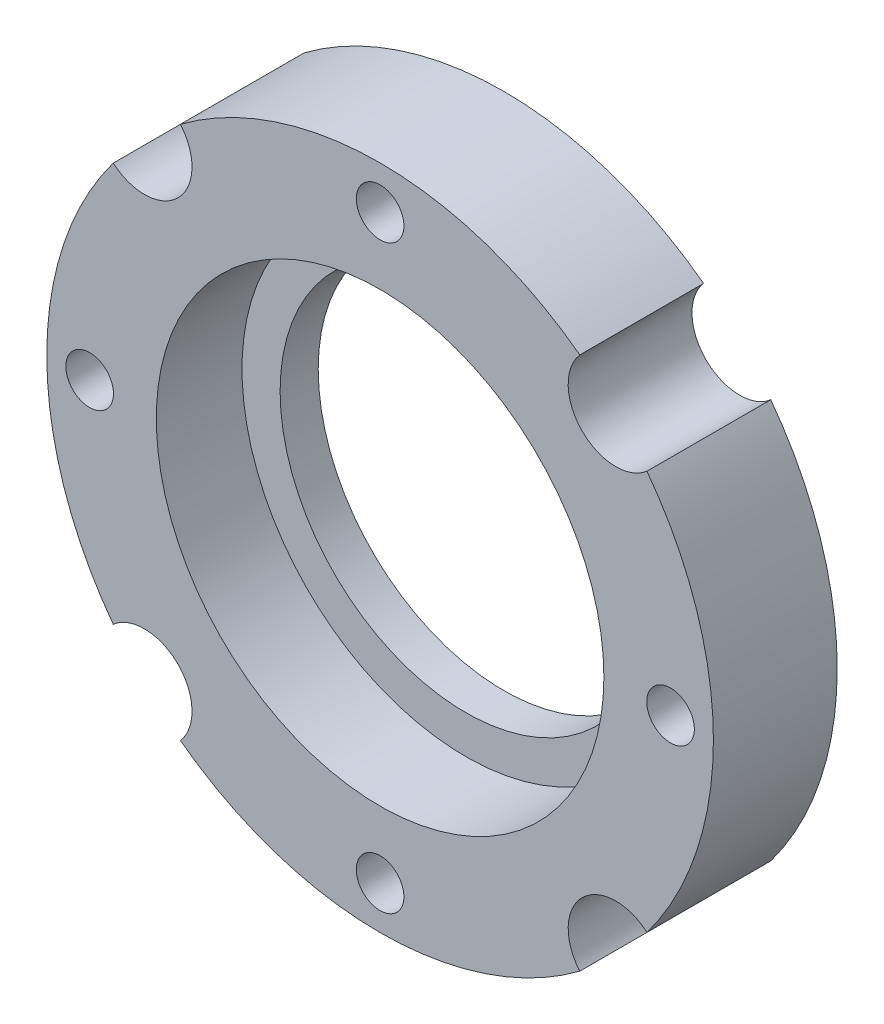
ISO-10303-21;
HEADER;
FILE_DESCRIPTION(('STEP AP214'),'2;1');
FILE_NAME('part.step','',(''),(''),'','','');
FILE_SCHEMA(('AUTOMOTIVE_DESIGN { 1 0 10303 214 1 1 1 1 }'));
ENDSEC;
DATA;
#1=APPLICATION_CONTEXT('core data for automotive mechanical design processes');
#2=APPLICATION_PROTOCOL_DEFINITION('international standard','automotive_design',2000,#1);
#3=PRODUCT_CONTEXT('',#1,'mechanical');
#4=PRODUCT('Part','Part','',(#3));
#5=PRODUCT_RELATED_PRODUCT_CATEGORY('part','',(#4));
#6=PRODUCT_DEFINITION_FORMATION('','',#4);
#7=PRODUCT_DEFINITION_CONTEXT('part definition',#1,'design');
#8=PRODUCT_DEFINITION('design','',#6,#7);
#9=PRODUCT_DEFINITION_SHAPE('','',#8);
#10=(LENGTH_UNIT() NAMED_UNIT(*) SI_UNIT(.MILLI.,.METRE.));
#11=(NAMED_UNIT(*) PLANE_ANGLE_UNIT() SI_UNIT($,.RADIAN.));
#12=(NAMED_UNIT(*) SI_UNIT($,.STERADIAN.) SOLID_ANGLE_UNIT());
#13=UNCERTAINTY_MEASURE_WITH_UNIT(LENGTH_MEASURE(1.E-05),#10,'distance_accuracy_value','');
#14=(GEOMETRIC_REPRESENTATION_CONTEXT(3) GLOBAL_UNCERTAINTY_ASSIGNED_CONTEXT((#13)) GLOBAL_UNIT_ASSIGNED_CONTEXT((#10,
#11,#12)) REPRESENTATION_CONTEXT('',''));
#15=CARTESIAN_POINT('',(0.,0.,0.));
#16=DIRECTION('',(0.,0.,1.));
#17=DIRECTION('',(1.,0.,0.));
#18=AXIS2_PLACEMENT_3D('',#15,#16,#17);
#19=CARTESIAN_POINT('',(0.,0.,13.));
#20=DIRECTION('',(0.,0.,-1.));
#21=DIRECTION('',(-1.,0.,0.));
#22=AXIS2_PLACEMENT_3D('',#19,#20,#21);
#23=CYLINDRICAL_SURFACE('',#22,35.);
#24=CARTESIAN_POINT('',(0.,0.,0.));
#25=DIRECTION('',(0.,0.,1.));
#26=DIRECTION('',(1.,0.,0.));
#27=AXIS2_PLACEMENT_3D('',#24,#25,#26);
#28=CIRCLE('',#27,35.);
#29=CARTESIAN_POINT('',(-20.9696960521531,-28.022702358629,0.));
#30=VERTEX_POINT('',#29);
#31=CARTESIAN_POINT('',(20.9696960521534,-28.0227023586288,0.));
#32=VERTEX_POINT('',#31);
#33=EDGE_CURVE('E141',#30,#32,#28,.T.);
#34=ORIENTED_EDGE('',*,*,#33,.T.);
#35=DIRECTION('',(0.,0.,1.));
#36=VECTOR('',#35,1.);
#37=CARTESIAN_POINT('',(20.9696960521534,-28.0227023586288,6.));
#38=LINE('',#37,#36);
#39=CARTESIAN_POINT('',(20.9696960521534,-28.0227023586288,13.));
#40=VERTEX_POINT('',#39);
#41=EDGE_CURVE('E56',#32,#40,#38,.T.);
#42=ORIENTED_EDGE('',*,*,#41,.T.);
#43=CARTESIAN_POINT('',(0.,0.,13.));
#44=DIRECTION('',(0.,0.,1.));
#45=DIRECTION('',(1.,0.,0.));
#46=AXIS2_PLACEMENT_3D('',#43,#44,#45);
#47=CIRCLE('',#46,35.);
#48=CARTESIAN_POINT('',(-20.9696960521531,-28.0227023586291,13.));
#49=VERTEX_POINT('',#48);
#50=EDGE_CURVE('E128',#49,#40,#47,.T.);
#51=ORIENTED_EDGE('',*,*,#50,.F.);
#52=DIRECTION('',(0.,0.,1.));
#53=VECTOR('',#52,1.);
#54=CARTESIAN_POINT('',(-20.9696960521531,-28.0227023586291,6.));
#55=LINE('',#54,#53);
#56=EDGE_CURVE('E106',#49,#30,#55,.F.);
#57=ORIENTED_EDGE('',*,*,#56,.T.);
#58=EDGE_LOOP('',(#34,#42,#51,#57));
#59=FACE_BOUND('',#58,.T.);
#60=ADVANCED_FACE('F41',(#59),#23,.T.);
#61=CARTESIAN_POINT('',(28.0227023586289,-20.9696960521533,13.));
#62=VERTEX_POINT('',#61);
#63=CARTESIAN_POINT('',(28.0227023586288,20.9696960521534,13.));
#64=VERTEX_POINT('',#63);
#65=EDGE_CURVE('E131',#62,#64,#47,.T.);
#66=ORIENTED_EDGE('',*,*,#65,.F.);
#67=DIRECTION('',(0.,0.,1.));
#68=VECTOR('',#67,1.);
#69=CARTESIAN_POINT('',(28.0227023586289,-20.9696960521533,6.));
#70=LINE('',#69,#68);
#71=CARTESIAN_POINT('',(28.0227023586289,-20.9696960521533,0.));
#72=VERTEX_POINT('',#71);
#73=EDGE_CURVE('E163',#62,#72,#70,.F.);
#74=ORIENTED_EDGE('',*,*,#73,.T.);
#75=CARTESIAN_POINT('',(28.0227023586288,20.9696960521534,0.));
#76=VERTEX_POINT('',#75);
#77=EDGE_CURVE('E138',#72,#76,#28,.T.);
#78=ORIENTED_EDGE('',*,*,#77,.T.);
#79=DIRECTION('',(0.,0.,1.));
#80=VECTOR('',#79,1.);
#81=CARTESIAN_POINT('',(28.0227023586288,20.9696960521534,6.));
#82=LINE('',#81,#80);
#83=EDGE_CURVE('E162',#76,#64,#82,.T.);
#84=ORIENTED_EDGE('',*,*,#83,.T.);
#85=EDGE_LOOP('',(#66,#74,#78,#84));
#86=FACE_BOUND('',#85,.T.);
#87=ADVANCED_FACE('F161',(#86),#23,.T.);
#88=CARTESIAN_POINT('',(20.9696960521533,28.0227023586289,13.));
#89=VERTEX_POINT('',#88);
#90=CARTESIAN_POINT('',(-20.9696960521531,28.0227023586291,13.));
#91=VERTEX_POINT('',#90);
#92=EDGE_CURVE('E127',#89,#91,#47,.T.);
#93=ORIENTED_EDGE('',*,*,#92,.F.);
#94=DIRECTION('',(0.,0.,1.));
#95=VECTOR('',#94,1.);
#96=CARTESIAN_POINT('',(20.9696960521533,28.0227023586289,6.));
#97=LINE('',#96,#95);
#98=CARTESIAN_POINT('',(20.9696960521533,28.0227023586289,0.));
#99=VERTEX_POINT('',#98);
#100=EDGE_CURVE('E167',#89,#99,#97,.F.);
#101=ORIENTED_EDGE('',*,*,#100,.T.);
#102=CARTESIAN_POINT('',(-20.9696960521531,28.022702358629,0.));
#103=VERTEX_POINT('',#102);
#104=EDGE_CURVE('E142',#99,#103,#28,.T.);
#105=ORIENTED_EDGE('',*,*,#104,.T.);
#106=DIRECTION('',(0.,0.,1.));
#107=VECTOR('',#106,1.);
#108=CARTESIAN_POINT('',(-20.9696960521531,28.0227023586291,6.));
#109=LINE('',#108,#107);
#110=EDGE_CURVE('E238',#103,#91,#109,.T.);
#111=ORIENTED_EDGE('',*,*,#110,.T.);
#112=EDGE_LOOP('',(#93,#101,#105,#111));
#113=FACE_BOUND('',#112,.T.);
#114=ADVANCED_FACE('F223',(#113),#23,.T.);
#115=CARTESIAN_POINT('',(0.,0.,13.));
#116=DIRECTION('',(0.,0.,-1.));
#117=DIRECTION('',(-1.,0.,0.));
#118=AXIS2_PLACEMENT_3D('',#115,#116,#117);
#119=CYLINDRICAL_SURFACE('',#118,19.5);
#120=CARTESIAN_POINT('',(0.,0.,0.));
#121=DIRECTION('',(0.,0.,1.));
#122=DIRECTION('',(1.,0.,0.));
#123=AXIS2_PLACEMENT_3D('',#120,#121,#122);
#124=CIRCLE('',#123,19.5);
#125=CARTESIAN_POINT('',(-19.5,0.,0.));
#126=VERTEX_POINT('',#125);
#127=EDGE_CURVE('E135',#126,#126,#124,.T.);
#128=CARTESIAN_POINT('',(0.,0.,4.));
#129=DIRECTION('',(0.,0.,1.));
#130=DIRECTION('',(1.,0.,0.));
#131=AXIS2_PLACEMENT_3D('',#128,#129,#130);
#132=CIRCLE('',#131,19.5);
#133=CARTESIAN_POINT('',(-19.5,0.,4.));
#134=VERTEX_POINT('',#133);
#135=EDGE_CURVE('E165',#134,#134,#132,.T.);
#136=CARTESIAN_POINT('',(-19.5,0.,0.));
#137=CARTESIAN_POINT('',(-19.5,0.,0.0416666666666667));
#138=CARTESIAN_POINT('',(-19.5,0.,0.0833333333333334));
#139=CARTESIAN_POINT('',(-19.5,0.,0.166666666666667));
#140=CARTESIAN_POINT('',(-19.5,0.,0.208333333333334));
#141=CARTESIAN_POINT('',(-19.5,0.,0.291666666666667));
#142=CARTESIAN_POINT('',(-19.5,0.,0.333333333333334));
#143=CARTESIAN_POINT('',(-19.5,0.,0.416666666666667));
#144=CARTESIAN_POINT('',(-19.5,0.,0.458333333333334));
#145=CARTESIAN_POINT('',(-19.5,0.,0.541666666666667));
#146=CARTESIAN_POINT('',(-19.5,0.,0.583333333333334));
#147=CARTESIAN_POINT('',(-19.5,0.,0.666666666666667));
#148=CARTESIAN_POINT('',(-19.5,0.,0.708333333333334));
#149=CARTESIAN_POINT('',(-19.5,0.,0.791666666666667));
#150=CARTESIAN_POINT('',(-19.5,0.,0.833333333333334));
#151=CARTESIAN_POINT('',(-19.5,0.,0.916666666666668));
#152=CARTESIAN_POINT('',(-19.5,0.,0.958333333333334));
#153=CARTESIAN_POINT('',(-19.5,0.,1.04166666666667));
#154=CARTESIAN_POINT('',(-19.5,0.,1.08333333333333));
#155=CARTESIAN_POINT('',(-19.5,0.,1.16666666666667));
#156=CARTESIAN_POINT('',(-19.5,0.,1.20833333333333));
#157=CARTESIAN_POINT('',(-19.5,0.,1.29166666666667));
#158=CARTESIAN_POINT('',(-19.5,0.,1.33333333333333));
#159=CARTESIAN_POINT('',(-19.5,0.,1.41666666666667));
#160=CARTESIAN_POINT('',(-19.5,0.,1.45833333333333));
#161=CARTESIAN_POINT('',(-19.5,0.,1.54166666666667));
#162=CARTESIAN_POINT('',(-19.5,0.,1.58333333333333));
#163=CARTESIAN_POINT('',(-19.5,0.,1.66666666666667));
#164=CARTESIAN_POINT('',(-19.5,0.,1.70833333333333));
#165=CARTESIAN_POINT('',(-19.5,0.,1.79166666666667));
#166=CARTESIAN_POINT('',(-19.5,0.,1.83333333333333));
#167=CARTESIAN_POINT('',(-19.5,0.,1.91666666666667));
#168=CARTESIAN_POINT('',(-19.5,0.,1.95833333333333));
#169=CARTESIAN_POINT('',(-19.5,0.,2.04166666666667));
#170=CARTESIAN_POINT('',(-19.5,0.,2.08333333333333));
#171=CARTESIAN_POINT('',(-19.5,0.,2.16666666666667));
#172=CARTESIAN_POINT('',(-19.5,0.,2.20833333333333));
#173=CARTESIAN_POINT('',(-19.5,0.,2.29166666666667));
#174=CARTESIAN_POINT('',(-19.5,0.,2.33333333333333));
#175=CARTESIAN_POINT('',(-19.5,0.,2.41666666666667));
#176=CARTESIAN_POINT('',(-19.5,0.,2.45833333333333));
#177=CARTESIAN_POINT('',(-19.5,0.,2.54166666666667));
#178=CARTESIAN_POINT('',(-19.5,0.,2.58333333333333));
#179=CARTESIAN_POINT('',(-19.5,0.,2.66666666666667));
#180=CARTESIAN_POINT('',(-19.5,0.,2.70833333333333));
#181=CARTESIAN_POINT('',(-19.5,0.,2.79166666666667));
#182=CARTESIAN_POINT('',(-19.5,0.,2.83333333333333));
#183=CARTESIAN_POINT('',(-19.5,0.,2.91666666666667));
#184=CARTESIAN_POINT('',(-19.5,0.,2.95833333333333));
#185=CARTESIAN_POINT('',(-19.5,0.,3.04166666666667));
#186=CARTESIAN_POINT('',(-19.5,0.,3.08333333333333));
#187=CARTESIAN_POINT('',(-19.5,0.,3.16666666666667));
#188=CARTESIAN_POINT('',(-19.5,0.,3.20833333333333));
#189=CARTESIAN_POINT('',(-19.5,0.,3.29166666666667));
#190=CARTESIAN_POINT('',(-19.5,0.,3.33333333333333));
#191=CARTESIAN_POINT('',(-19.5,0.,3.41666666666667));
#192=CARTESIAN_POINT('',(-19.5,0.,3.45833333333333));
#193=CARTESIAN_POINT('',(-19.5,0.,3.54166666666667));
#194=CARTESIAN_POINT('',(-19.5,0.,3.58333333333333));
#195=CARTESIAN_POINT('',(-19.5,0.,3.66666666666667));
#196=CARTESIAN_POINT('',(-19.5,0.,3.70833333333333));
#197=CARTESIAN_POINT('',(-19.5,0.,3.79166666666667));
#198=CARTESIAN_POINT('',(-19.5,0.,3.83333333333333));
#199=CARTESIAN_POINT('',(-19.5,0.,3.91666666666667));
#200=CARTESIAN_POINT('',(-19.5,0.,3.95833333333333));
#201=CARTESIAN_POINT('',(-19.5,0.,4.));
#202=B_SPLINE_CURVE_WITH_KNOTS('',3,(#136,#137,#138,#139,#140,#141,#142,#143,#144,#145,#146,
#147,#148,#149,#150,#151,#152,#153,#154,#155,#156,#157,#158,#159,#160,#161,#162,#163,#164,#165,
#166,#167,#168,#169,#170,#171,#172,#173,#174,#175,#176,#177,#178,#179,#180,#181,#182,#183,#184,
#185,#186,#187,#188,#189,#190,#191,#192,#193,#194,#195,#196,#197,#198,#199,#200,#201),
.UNSPECIFIED.,.F.,.F.,(4,2,2,2,2,2,2,2,2,2,2,2,2,2,2,2,2,2,2,2,2,2,2,2,2,2,2,2,2,2,2,2,4),(0.,
0.125,0.25,0.375,0.5,0.625000000000001,0.750000000000001,0.875000000000001,1.,1.125,1.25,1.375,
1.5,1.625,1.75,1.875,2.,2.125,2.25,2.375,2.5,2.625,2.75,2.875,3.,3.125,3.25,3.375,3.5,3.625,
3.75,3.875,4.),.UNSPECIFIED.);
#203=EDGE_CURVE('BSEAM226',#126,#134,#202,.T.);
#204=ORIENTED_EDGE('',*,*,#127,.F.);
#205=ORIENTED_EDGE('',*,*,#135,.T.);
#206=ORIENTED_EDGE('',*,*,#203,.T.);
#207=ORIENTED_EDGE('',*,*,#203,.F.);
#208=EDGE_LOOP('',(#204,#206,#205,#207));
#209=FACE_BOUND('',#208,.T.);
#210=ADVANCED_FACE('F226',(#209),#119,.F.);
#211=CARTESIAN_POINT('',(-28.0227023586287,20.9696960521536,13.));
#212=VERTEX_POINT('',#211);
#213=CARTESIAN_POINT('',(-28.0227023586287,-20.9696960521536,13.));
#214=VERTEX_POINT('',#213);
#215=EDGE_CURVE('E117',#212,#214,#47,.T.);
#216=ORIENTED_EDGE('',*,*,#215,.F.);
#217=DIRECTION('',(0.,0.,1.));
#218=VECTOR('',#217,1.);
#219=CARTESIAN_POINT('',(-28.0227023586287,20.9696960521536,6.));
#220=LINE('',#219,#218);
#221=CARTESIAN_POINT('',(-28.0227023586287,20.9696960521536,0.));
#222=VERTEX_POINT('',#221);
#223=EDGE_CURVE('E120',#212,#222,#220,.F.);
#224=ORIENTED_EDGE('',*,*,#223,.T.);
#225=CARTESIAN_POINT('',(-28.0227023586287,-20.9696960521536,0.));
#226=VERTEX_POINT('',#225);
#227=EDGE_CURVE('E119',#222,#226,#28,.T.);
#228=ORIENTED_EDGE('',*,*,#227,.T.);
#229=DIRECTION('',(0.,0.,1.));
#230=VECTOR('',#229,1.);
#231=CARTESIAN_POINT('',(-28.0227023586287,-20.9696960521536,6.));
#232=LINE('',#231,#230);
#233=EDGE_CURVE('E63',#226,#214,#232,.T.);
#234=ORIENTED_EDGE('',*,*,#233,.T.);
#235=EDGE_LOOP('',(#216,#224,#228,#234));
#236=FACE_BOUND('',#235,.T.);
#237=ADVANCED_FACE('F43',(#236),#23,.T.);
#238=CARTESIAN_POINT('',(0.,0.,13.));
#239=DIRECTION('',(0.,0.,1.));
#240=DIRECTION('',(1.,0.,0.));
#241=AXIS2_PLACEMENT_3D('',#238,#239,#240);
#242=PLANE('',#241);
#243=CARTESIAN_POINT('',(24.7487373415292,-24.7487373415291,13.));
#244=DIRECTION('',(0.,0.,1.));
#245=DIRECTION('',(1.,0.,0.));
#246=AXIS2_PLACEMENT_3D('',#243,#244,#245);
#247=CIRCLE('',#246,5.);
#248=EDGE_CURVE('E241',#62,#40,#247,.T.);
#249=ORIENTED_EDGE('',*,*,#248,.F.);
#250=ORIENTED_EDGE('',*,*,#65,.T.);
#251=CARTESIAN_POINT('',(24.7487373415291,24.7487373415292,13.));
#252=DIRECTION('',(0.,0.,1.));
#253=DIRECTION('',(1.,0.,0.));
#254=AXIS2_PLACEMENT_3D('',#251,#252,#253);
#255=CIRCLE('',#254,5.);
#256=EDGE_CURVE('E240',#89,#64,#255,.T.);
#257=ORIENTED_EDGE('',*,*,#256,.F.);
#258=ORIENTED_EDGE('',*,*,#92,.T.);
#259=CARTESIAN_POINT('',(-24.748737341529,24.7487373415294,13.));
#260=DIRECTION('',(0.,0.,1.));
#261=DIRECTION('',(1.,0.,0.));
#262=AXIS2_PLACEMENT_3D('',#259,#260,#261);
#263=CIRCLE('',#262,5.);
#264=EDGE_CURVE('E111',#212,#91,#263,.T.);
#265=ORIENTED_EDGE('',*,*,#264,.F.);
#266=ORIENTED_EDGE('',*,*,#215,.T.);
#267=CARTESIAN_POINT('',(-24.748737341529,-24.7487373415294,13.));
#268=DIRECTION('',(0.,0.,1.));
#269=DIRECTION('',(1.,0.,0.));
#270=AXIS2_PLACEMENT_3D('',#267,#268,#269);
#271=CIRCLE('',#270,5.);
#272=EDGE_CURVE('E103',#49,#214,#271,.T.);
#273=ORIENTED_EDGE('',*,*,#272,.F.);
#274=ORIENTED_EDGE('',*,*,#50,.T.);
#275=EDGE_LOOP('',(#249,#250,#257,#258,#265,#266,#273,#274));
#276=FACE_BOUND('',#275,.T.);
#277=CARTESIAN_POINT('',(0.,0.,13.));
#278=DIRECTION('',(0.,0.,1.));
#279=DIRECTION('',(1.,0.,0.));
#280=AXIS2_PLACEMENT_3D('',#277,#278,#279);
#281=CIRCLE('',#280,23.5);
#282=CARTESIAN_POINT('',(23.5,0.,13.));
#283=VERTEX_POINT('',#282);
#284=EDGE_CURVE('E173',#283,#283,#281,.T.);
#285=ORIENTED_EDGE('',*,*,#284,.F.);
#286=EDGE_LOOP('',(#285));
#287=FACE_BOUND('',#286,.T.);
#288=CARTESIAN_POINT('',(0.,30.5,13.));
#289=DIRECTION('',(0.,0.,1.));
#290=DIRECTION('',(1.,0.,0.));
#291=AXIS2_PLACEMENT_3D('',#288,#289,#290);
#292=CIRCLE('',#291,2.49999999999999);
#293=CARTESIAN_POINT('',(2.49999999999999,30.5,13.));
#294=VERTEX_POINT('',#293);
#295=EDGE_CURVE('E177',#294,#294,#292,.T.);
#296=ORIENTED_EDGE('',*,*,#295,.F.);
#297=EDGE_LOOP('',(#296));
#298=FACE_BOUND('',#297,.T.);
#299=CARTESIAN_POINT('',(0.,-30.5,13.));
#300=DIRECTION('',(0.,0.,1.));
#301=DIRECTION('',(1.,0.,0.));
#302=AXIS2_PLACEMENT_3D('',#299,#300,#301);
#303=CIRCLE('',#302,2.49999999999999);
#304=CARTESIAN_POINT('',(2.49999999999999,-30.5,13.));
#305=VERTEX_POINT('',#304);
#306=EDGE_CURVE('E185',#305,#305,#303,.T.);
#307=ORIENTED_EDGE('',*,*,#306,.F.);
#308=EDGE_LOOP('',(#307));
#309=FACE_BOUND('',#308,.T.);
#310=CARTESIAN_POINT('',(-30.5,0.,13.));
#311=DIRECTION('',(0.,0.,1.));
#312=DIRECTION('',(1.,0.,0.));
#313=AXIS2_PLACEMENT_3D('',#310,#311,#312);
#314=CIRCLE('',#313,2.49999999999999);
#315=CARTESIAN_POINT('',(-28.,0.,13.));
#316=VERTEX_POINT('',#315);
#317=EDGE_CURVE('E191',#316,#316,#314,.T.);
#318=ORIENTED_EDGE('',*,*,#317,.F.);
#319=EDGE_LOOP('',(#318));
#320=FACE_BOUND('',#319,.T.);
#321=CARTESIAN_POINT('',(30.5,0.,13.));
#322=DIRECTION('',(0.,0.,1.));
#323=DIRECTION('',(1.,0.,0.));
#324=AXIS2_PLACEMENT_3D('',#321,#322,#323);
#325=CIRCLE('',#324,2.49999999999999);
#326=CARTESIAN_POINT('',(33.,0.,13.));
#327=VERTEX_POINT('',#326);
#328=EDGE_CURVE('E196',#327,#327,#325,.T.);
#329=ORIENTED_EDGE('',*,*,#328,.F.);
#330=EDGE_LOOP('',(#329));
#331=FACE_BOUND('',#330,.T.);
#332=ADVANCED_FACE('F124',(#276,#287,#298,#309,#320,#331),#242,.T.);
#333=CARTESIAN_POINT('',(0.,0.,0.));
#334=DIRECTION('',(0.,0.,1.));
#335=DIRECTION('',(1.,0.,0.));
#336=AXIS2_PLACEMENT_3D('',#333,#334,#335);
#337=PLANE('',#336);
#338=CARTESIAN_POINT('',(0.,30.5,0.));
#339=DIRECTION('',(0.,0.,1.));
#340=DIRECTION('',(1.,0.,0.));
#341=AXIS2_PLACEMENT_3D('',#338,#339,#340);
#342=CIRCLE('',#341,2.5);
#343=CARTESIAN_POINT('',(2.5,30.5,0.));
#344=VERTEX_POINT('',#343);
#345=EDGE_CURVE('E182',#344,#344,#342,.T.);
#346=ORIENTED_EDGE('',*,*,#345,.T.);
#347=EDGE_LOOP('',(#346));
#348=FACE_BOUND('',#347,.T.);
#349=CARTESIAN_POINT('',(0.,-30.5,0.));
#350=DIRECTION('',(0.,0.,1.));
#351=DIRECTION('',(1.,0.,0.));
#352=AXIS2_PLACEMENT_3D('',#349,#350,#351);
#353=CIRCLE('',#352,2.5);
#354=CARTESIAN_POINT('',(2.5,-30.5,0.));
#355=VERTEX_POINT('',#354);
#356=EDGE_CURVE('E188',#355,#355,#353,.T.);
#357=ORIENTED_EDGE('',*,*,#356,.T.);
#358=EDGE_LOOP('',(#357));
#359=FACE_BOUND('',#358,.T.);
#360=CARTESIAN_POINT('',(-30.5,0.,0.));
#361=DIRECTION('',(0.,0.,1.));
#362=DIRECTION('',(1.,0.,0.));
#363=AXIS2_PLACEMENT_3D('',#360,#361,#362);
#364=CIRCLE('',#363,2.5);
#365=CARTESIAN_POINT('',(-28.,0.,0.));
#366=VERTEX_POINT('',#365);
#367=EDGE_CURVE('E194',#366,#366,#364,.T.);
#368=ORIENTED_EDGE('',*,*,#367,.T.);
#369=EDGE_LOOP('',(#368));
#370=FACE_BOUND('',#369,.T.);
#371=CARTESIAN_POINT('',(30.5,0.,0.));
#372=DIRECTION('',(0.,0.,1.));
#373=DIRECTION('',(1.,0.,0.));
#374=AXIS2_PLACEMENT_3D('',#371,#372,#373);
#375=CIRCLE('',#374,2.5);
#376=CARTESIAN_POINT('',(33.,0.,0.));
#377=VERTEX_POINT('',#376);
#378=EDGE_CURVE('E136',#377,#377,#375,.T.);
#379=ORIENTED_EDGE('',*,*,#378,.T.);
#380=EDGE_LOOP('',(#379));
#381=FACE_BOUND('',#380,.T.);
#382=ORIENTED_EDGE('',*,*,#77,.F.);
#383=CARTESIAN_POINT('',(24.7487373415292,-24.7487373415291,0.));
#384=DIRECTION('',(0.,0.,1.));
#385=DIRECTION('',(1.,0.,0.));
#386=AXIS2_PLACEMENT_3D('',#383,#384,#385);
#387=CIRCLE('',#386,5.);
#388=EDGE_CURVE('E11',#72,#32,#387,.T.);
#389=ORIENTED_EDGE('',*,*,#388,.T.);
#390=ORIENTED_EDGE('',*,*,#33,.F.);
#391=CARTESIAN_POINT('',(-24.748737341529,-24.7487373415294,0.));
#392=DIRECTION('',(0.,0.,1.));
#393=DIRECTION('',(1.,0.,0.));
#394=AXIS2_PLACEMENT_3D('',#391,#392,#393);
#395=CIRCLE('',#394,5.);
#396=EDGE_CURVE('E130',#30,#226,#395,.T.);
#397=ORIENTED_EDGE('',*,*,#396,.T.);
#398=ORIENTED_EDGE('',*,*,#227,.F.);
#399=CARTESIAN_POINT('',(-24.748737341529,24.7487373415294,0.));
#400=DIRECTION('',(0.,0.,1.));
#401=DIRECTION('',(1.,0.,0.));
#402=AXIS2_PLACEMENT_3D('',#399,#400,#401);
#403=CIRCLE('',#402,5.);
#404=EDGE_CURVE('E146',#222,#103,#403,.T.);
#405=ORIENTED_EDGE('',*,*,#404,.T.);
#406=ORIENTED_EDGE('',*,*,#104,.F.);
#407=CARTESIAN_POINT('',(24.7487373415291,24.7487373415292,0.));
#408=DIRECTION('',(0.,0.,1.));
#409=DIRECTION('',(1.,0.,0.));
#410=AXIS2_PLACEMENT_3D('',#407,#408,#409);
#411=CIRCLE('',#410,5.);
#412=EDGE_CURVE('E49',#99,#76,#411,.T.);
#413=ORIENTED_EDGE('',*,*,#412,.T.);
#414=EDGE_LOOP('',(#382,#389,#390,#397,#398,#405,#406,#413));
#415=FACE_BOUND('',#414,.T.);
#416=ORIENTED_EDGE('',*,*,#127,.T.);
#417=EDGE_LOOP('',(#416));
#418=FACE_BOUND('',#417,.T.);
#419=ADVANCED_FACE('F152',(#348,#359,#370,#381,#415,#418),#337,.F.);
#420=CARTESIAN_POINT('',(30.5,0.,13.));
#421=DIRECTION('',(0.,0.,1.));
#422=DIRECTION('',(1.,0.,0.));
#423=AXIS2_PLACEMENT_3D('',#420,#421,#422);
#424=CYLINDRICAL_SURFACE('',#423,2.49999999999999);
#425=ORIENTED_EDGE('',*,*,#378,.F.);
#426=EDGE_LOOP('',(#425));
#427=FACE_BOUND('',#426,.T.);
#428=ORIENTED_EDGE('',*,*,#328,.T.);
#429=EDGE_LOOP('',(#428));
#430=FACE_BOUND('',#429,.T.);
#431=ADVANCED_FACE('F204',(#427,#430),#424,.F.);
#432=CARTESIAN_POINT('',(-30.5,0.,13.));
#433=DIRECTION('',(0.,0.,1.));
#434=DIRECTION('',(1.,0.,0.));
#435=AXIS2_PLACEMENT_3D('',#432,#433,#434);
#436=CYLINDRICAL_SURFACE('',#435,2.49999999999999);
#437=ORIENTED_EDGE('',*,*,#367,.F.);
#438=EDGE_LOOP('',(#437));
#439=FACE_BOUND('',#438,.T.);
#440=ORIENTED_EDGE('',*,*,#317,.T.);
#441=EDGE_LOOP('',(#440));
#442=FACE_BOUND('',#441,.T.);
#443=ADVANCED_FACE('F206',(#439,#442),#436,.F.);
#444=CARTESIAN_POINT('',(0.,-30.5,13.));
#445=DIRECTION('',(0.,0.,1.));
#446=DIRECTION('',(1.,0.,0.));
#447=AXIS2_PLACEMENT_3D('',#444,#445,#446);
#448=CYLINDRICAL_SURFACE('',#447,2.49999999999999);
#449=ORIENTED_EDGE('',*,*,#356,.F.);
#450=EDGE_LOOP('',(#449));
#451=FACE_BOUND('',#450,.T.);
#452=ORIENTED_EDGE('',*,*,#306,.T.);
#453=EDGE_LOOP('',(#452));
#454=FACE_BOUND('',#453,.T.);
#455=ADVANCED_FACE('F212',(#451,#454),#448,.F.);
#456=CARTESIAN_POINT('',(0.,30.5,13.));
#457=DIRECTION('',(0.,0.,1.));
#458=DIRECTION('',(1.,0.,0.));
#459=AXIS2_PLACEMENT_3D('',#456,#457,#458);
#460=CYLINDRICAL_SURFACE('',#459,2.49999999999999);
#461=ORIENTED_EDGE('',*,*,#345,.F.);
#462=EDGE_LOOP('',(#461));
#463=FACE_BOUND('',#462,.T.);
#464=ORIENTED_EDGE('',*,*,#295,.T.);
#465=EDGE_LOOP('',(#464));
#466=FACE_BOUND('',#465,.T.);
#467=ADVANCED_FACE('F270',(#463,#466),#460,.F.);
#468=CARTESIAN_POINT('',(0.,0.,4.));
#469=DIRECTION('',(0.,0.,1.));
#470=DIRECTION('',(1.,0.,0.));
#471=AXIS2_PLACEMENT_3D('',#468,#469,#470);
#472=CYLINDRICAL_SURFACE('',#471,23.5);
#473=CARTESIAN_POINT('',(0.,0.,4.));
#474=DIRECTION('',(0.,0.,1.));
#475=DIRECTION('',(1.,0.,0.));
#476=AXIS2_PLACEMENT_3D('',#473,#474,#475);
#477=CIRCLE('',#476,23.5);
#478=CARTESIAN_POINT('',(23.5,0.,4.));
#479=VERTEX_POINT('',#478);
#480=EDGE_CURVE('E174',#479,#479,#477,.T.);
#481=ORIENTED_EDGE('',*,*,#480,.F.);
#482=EDGE_LOOP('',(#481));
#483=FACE_BOUND('',#482,.T.);
#484=ORIENTED_EDGE('',*,*,#284,.T.);
#485=EDGE_LOOP('',(#484));
#486=FACE_BOUND('',#485,.T.);
#487=ADVANCED_FACE('F266',(#483,#486),#472,.F.);
#488=CARTESIAN_POINT('',(0.,0.,4.));
#489=DIRECTION('',(0.,0.,1.));
#490=DIRECTION('',(1.,0.,0.));
#491=AXIS2_PLACEMENT_3D('',#488,#489,#490);
#492=PLANE('',#491);
#493=ORIENTED_EDGE('',*,*,#135,.F.);
#494=EDGE_LOOP('',(#493));
#495=FACE_BOUND('',#494,.T.);
#496=ORIENTED_EDGE('',*,*,#480,.T.);
#497=EDGE_LOOP('',(#496));
#498=FACE_BOUND('',#497,.T.);
#499=ADVANCED_FACE('F263',(#495,#498),#492,.T.);
#500=CARTESIAN_POINT('',(-24.748737341529,-24.7487373415294,-1.));
#501=DIRECTION('',(0.,0.,1.));
#502=DIRECTION('',(1.,0.,0.));
#503=AXIS2_PLACEMENT_3D('',#500,#501,#502);
#504=CYLINDRICAL_SURFACE('',#503,5.);
#505=ORIENTED_EDGE('',*,*,#396,.F.);
#506=ORIENTED_EDGE('',*,*,#56,.F.);
#507=ORIENTED_EDGE('',*,*,#272,.T.);
#508=ORIENTED_EDGE('',*,*,#233,.F.);
#509=EDGE_LOOP('',(#505,#506,#507,#508));
#510=FACE_BOUND('',#509,.T.);
#511=ADVANCED_FACE('F104',(#510),#504,.F.);
#512=CARTESIAN_POINT('',(-24.748737341529,24.7487373415294,-1.));
#513=DIRECTION('',(0.,0.,1.));
#514=DIRECTION('',(1.,0.,0.));
#515=AXIS2_PLACEMENT_3D('',#512,#513,#514);
#516=CYLINDRICAL_SURFACE('',#515,5.);
#517=ORIENTED_EDGE('',*,*,#404,.F.);
#518=ORIENTED_EDGE('',*,*,#223,.F.);
#519=ORIENTED_EDGE('',*,*,#264,.T.);
#520=ORIENTED_EDGE('',*,*,#110,.F.);
#521=EDGE_LOOP('',(#517,#518,#519,#520));
#522=FACE_BOUND('',#521,.T.);
#523=ADVANCED_FACE('F257',(#522),#516,.F.);
#524=CARTESIAN_POINT('',(24.7487373415291,24.7487373415292,-1.));
#525=DIRECTION('',(0.,0.,1.));
#526=DIRECTION('',(1.,0.,0.));
#527=AXIS2_PLACEMENT_3D('',#524,#525,#526);
#528=CYLINDRICAL_SURFACE('',#527,5.);
#529=ORIENTED_EDGE('',*,*,#412,.F.);
#530=ORIENTED_EDGE('',*,*,#100,.F.);
#531=ORIENTED_EDGE('',*,*,#256,.T.);
#532=ORIENTED_EDGE('',*,*,#83,.F.);
#533=EDGE_LOOP('',(#529,#530,#531,#532));
#534=FACE_BOUND('',#533,.T.);
#535=ADVANCED_FACE('F252',(#534),#528,.F.);
#536=CARTESIAN_POINT('',(24.7487373415292,-24.7487373415291,-1.));
#537=DIRECTION('',(0.,0.,1.));
#538=DIRECTION('',(1.,0.,0.));
#539=AXIS2_PLACEMENT_3D('',#536,#537,#538);
#540=CYLINDRICAL_SURFACE('',#539,5.);
#541=ORIENTED_EDGE('',*,*,#388,.F.);
#542=ORIENTED_EDGE('',*,*,#73,.F.);
#543=ORIENTED_EDGE('',*,*,#248,.T.);
#544=ORIENTED_EDGE('',*,*,#41,.F.);
#545=EDGE_LOOP('',(#541,#542,#543,#544));
#546=FACE_BOUND('',#545,.T.);
#547=ADVANCED_FACE('F250',(#546),#540,.F.);
#548=CLOSED_SHELL('',(#60,#87,#114,#210,#237,#332,#419,#431,#443,#455,#467,#487,#499,#511,#523,
#535,#547));
#549=MANIFOLD_SOLID_BREP('B2',#548);
#550=ADVANCED_BREP_SHAPE_REPRESENTATION('',(#18,#549),#14);
#551=SHAPE_DEFINITION_REPRESENTATION(#9,#550);
ENDSEC;
END-ISO-10303-21;
